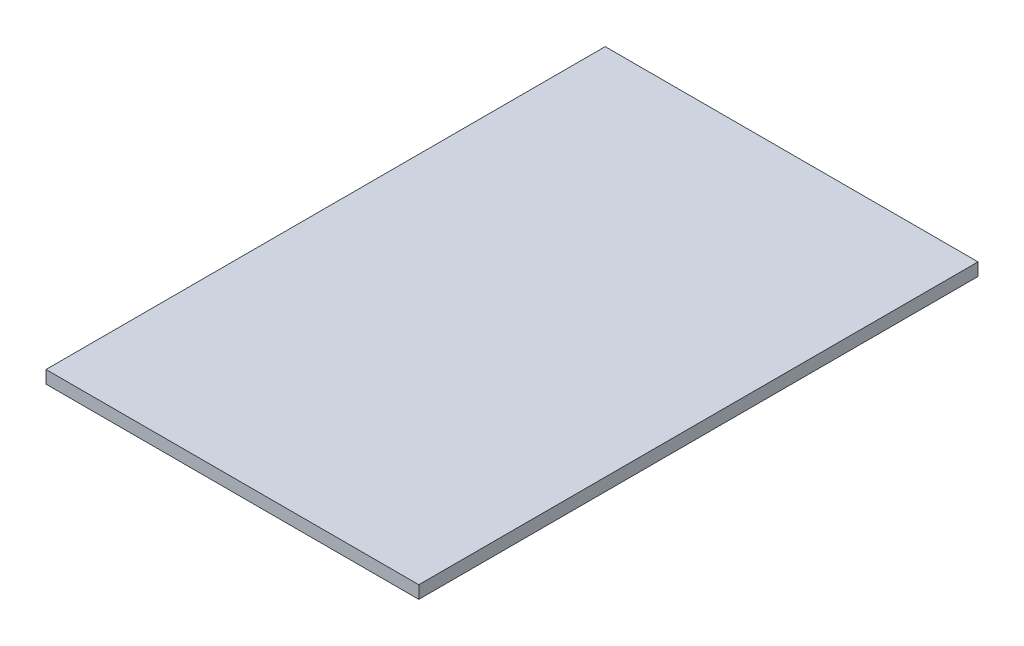
ISO-10303-21;
HEADER;
FILE_DESCRIPTION(('STEP AP214'),'2;1');
FILE_NAME('part.step','',(''),(''),'','','');
FILE_SCHEMA(('AUTOMOTIVE_DESIGN { 1 0 10303 214 1 1 1 1 }'));
ENDSEC;
DATA;
#1=APPLICATION_CONTEXT('core data for automotive mechanical design processes');
#2=APPLICATION_PROTOCOL_DEFINITION('international standard','automotive_design',2000,#1);
#3=PRODUCT_CONTEXT('',#1,'mechanical');
#4=PRODUCT('Part','Part','',(#3));
#5=PRODUCT_RELATED_PRODUCT_CATEGORY('part','',(#4));
#6=PRODUCT_DEFINITION_FORMATION('','',#4);
#7=PRODUCT_DEFINITION_CONTEXT('part definition',#1,'design');
#8=PRODUCT_DEFINITION('design','',#6,#7);
#9=PRODUCT_DEFINITION_SHAPE('','',#8);
#10=(LENGTH_UNIT() NAMED_UNIT(*) SI_UNIT(.MILLI.,.METRE.));
#11=(NAMED_UNIT(*) PLANE_ANGLE_UNIT() SI_UNIT($,.RADIAN.));
#12=(NAMED_UNIT(*) SI_UNIT($,.STERADIAN.) SOLID_ANGLE_UNIT());
#13=UNCERTAINTY_MEASURE_WITH_UNIT(LENGTH_MEASURE(1.E-05),#10,'distance_accuracy_value','');
#14=(GEOMETRIC_REPRESENTATION_CONTEXT(3) GLOBAL_UNCERTAINTY_ASSIGNED_CONTEXT((#13)) GLOBAL_UNIT_ASSIGNED_CONTEXT((#10,
#11,#12)) REPRESENTATION_CONTEXT('',''));
#15=CARTESIAN_POINT('',(0.,0.,0.));
#16=DIRECTION('',(0.,0.,1.));
#17=DIRECTION('',(1.,0.,0.));
#18=AXIS2_PLACEMENT_3D('',#15,#16,#17);
#19=CARTESIAN_POINT('',(-97.5278802689126,19.05,-759.698876734454));
#20=DIRECTION('',(0.,0.,1.));
#21=DIRECTION('',(1.,0.,0.));
#22=AXIS2_PLACEMENT_3D('',#19,#20,#21);
#23=PLANE('',#22);
#24=DIRECTION('',(-1.,0.,0.));
#25=VECTOR('',#24,1.);
#26=CARTESIAN_POINT('',(-97.5278802689126,0.,-759.698876734454));
#27=LINE('',#26,#25);
#28=CARTESIAN_POINT('',(461.272119731088,0.,-759.698876734454));
#29=VERTEX_POINT('',#28);
#30=CARTESIAN_POINT('',(-97.5278802689126,0.,-759.698876734454));
#31=VERTEX_POINT('',#30);
#32=EDGE_CURVE('E96',#29,#31,#27,.T.);
#33=ORIENTED_EDGE('',*,*,#32,.T.);
#34=DIRECTION('',(0.,-1.,0.));
#35=VECTOR('',#34,1.);
#36=CARTESIAN_POINT('',(-97.5278802689126,19.05,-759.698876734454));
#37=LINE('',#36,#35);
#38=CARTESIAN_POINT('',(-97.5278802689126,19.05,-759.698876734454));
#39=VERTEX_POINT('',#38);
#40=EDGE_CURVE('E11',#39,#31,#37,.T.);
#41=ORIENTED_EDGE('',*,*,#40,.F.);
#42=DIRECTION('',(-1.,0.,0.));
#43=VECTOR('',#42,1.);
#44=CARTESIAN_POINT('',(-97.5278802689126,19.05,-759.698876734454));
#45=LINE('',#44,#43);
#46=CARTESIAN_POINT('',(461.272119731088,19.05,-759.698876734454));
#47=VERTEX_POINT('',#46);
#48=EDGE_CURVE('E84',#47,#39,#45,.T.);
#49=ORIENTED_EDGE('',*,*,#48,.F.);
#50=DIRECTION('',(0.,-1.,0.));
#51=VECTOR('',#50,1.);
#52=CARTESIAN_POINT('',(461.272119731088,19.05,-759.698876734454));
#53=LINE('',#52,#51);
#54=EDGE_CURVE('E92',#47,#29,#53,.T.);
#55=ORIENTED_EDGE('',*,*,#54,.T.);
#56=EDGE_LOOP('',(#33,#41,#49,#55));
#57=FACE_BOUND('',#56,.T.);
#58=ADVANCED_FACE('F33',(#57),#23,.F.);
#59=CARTESIAN_POINT('',(-97.5278802689126,19.05,-759.698876734454));
#60=DIRECTION('',(1.,0.,0.));
#61=DIRECTION('',(0.,0.,-1.));
#62=AXIS2_PLACEMENT_3D('',#59,#60,#61);
#63=PLANE('',#62);
#64=DIRECTION('',(0.,0.,1.));
#65=VECTOR('',#64,1.);
#66=CARTESIAN_POINT('',(-97.5278802689126,0.,-759.698876734454));
#67=LINE('',#66,#65);
#68=CARTESIAN_POINT('',(-97.5278802689125,0.,78.5011232655459));
#69=VERTEX_POINT('',#68);
#70=EDGE_CURVE('E88',#31,#69,#67,.T.);
#71=ORIENTED_EDGE('',*,*,#70,.T.);
#72=DIRECTION('',(0.,-1.,0.));
#73=VECTOR('',#72,1.);
#74=CARTESIAN_POINT('',(-97.5278802689125,19.05,78.5011232655459));
#75=LINE('',#74,#73);
#76=CARTESIAN_POINT('',(-97.5278802689125,19.05,78.5011232655459));
#77=VERTEX_POINT('',#76);
#78=EDGE_CURVE('E41',#77,#69,#75,.T.);
#79=ORIENTED_EDGE('',*,*,#78,.F.);
#80=DIRECTION('',(0.,0.,1.));
#81=VECTOR('',#80,1.);
#82=CARTESIAN_POINT('',(-97.5278802689126,19.05,-759.698876734454));
#83=LINE('',#82,#81);
#84=EDGE_CURVE('E79',#39,#77,#83,.T.);
#85=ORIENTED_EDGE('',*,*,#84,.F.);
#86=ORIENTED_EDGE('',*,*,#40,.T.);
#87=EDGE_LOOP('',(#71,#79,#85,#86));
#88=FACE_BOUND('',#87,.T.);
#89=ADVANCED_FACE('F87',(#88),#63,.F.);
#90=CARTESIAN_POINT('',(-97.5278802689125,19.05,78.5011232655459));
#91=DIRECTION('',(0.,0.,-1.));
#92=DIRECTION('',(-1.,0.,0.));
#93=AXIS2_PLACEMENT_3D('',#90,#91,#92);
#94=PLANE('',#93);
#95=DIRECTION('',(1.,0.,0.));
#96=VECTOR('',#95,1.);
#97=CARTESIAN_POINT('',(-97.5278802689125,0.,78.5011232655459));
#98=LINE('',#97,#96);
#99=CARTESIAN_POINT('',(461.272119731087,0.,78.5011232655459));
#100=VERTEX_POINT('',#99);
#101=EDGE_CURVE('E66',#69,#100,#98,.T.);
#102=ORIENTED_EDGE('',*,*,#101,.T.);
#103=DIRECTION('',(0.,-1.,0.));
#104=VECTOR('',#103,1.);
#105=CARTESIAN_POINT('',(461.272119731087,19.05,78.5011232655459));
#106=LINE('',#105,#104);
#107=CARTESIAN_POINT('',(461.272119731087,19.05,78.5011232655459));
#108=VERTEX_POINT('',#107);
#109=EDGE_CURVE('E89',#108,#100,#106,.T.);
#110=ORIENTED_EDGE('',*,*,#109,.F.);
#111=DIRECTION('',(1.,0.,0.));
#112=VECTOR('',#111,1.);
#113=CARTESIAN_POINT('',(-97.5278802689125,19.05,78.5011232655459));
#114=LINE('',#113,#112);
#115=EDGE_CURVE('E82',#77,#108,#114,.T.);
#116=ORIENTED_EDGE('',*,*,#115,.F.);
#117=ORIENTED_EDGE('',*,*,#78,.T.);
#118=EDGE_LOOP('',(#102,#110,#116,#117));
#119=FACE_BOUND('',#118,.T.);
#120=ADVANCED_FACE('F90',(#119),#94,.F.);
#121=CARTESIAN_POINT('',(461.272119731087,19.05,78.5011232655459));
#122=DIRECTION('',(-1.,0.,0.));
#123=DIRECTION('',(0.,0.,1.));
#124=AXIS2_PLACEMENT_3D('',#121,#122,#123);
#125=PLANE('',#124);
#126=DIRECTION('',(0.,0.,-1.));
#127=VECTOR('',#126,1.);
#128=CARTESIAN_POINT('',(461.272119731087,0.,78.5011232655459));
#129=LINE('',#128,#127);
#130=EDGE_CURVE('E72',#100,#29,#129,.T.);
#131=ORIENTED_EDGE('',*,*,#130,.T.);
#132=ORIENTED_EDGE('',*,*,#54,.F.);
#133=DIRECTION('',(0.,0.,-1.));
#134=VECTOR('',#133,1.);
#135=CARTESIAN_POINT('',(461.272119731087,19.05,78.5011232655459));
#136=LINE('',#135,#134);
#137=EDGE_CURVE('E49',#108,#47,#136,.T.);
#138=ORIENTED_EDGE('',*,*,#137,.F.);
#139=ORIENTED_EDGE('',*,*,#109,.T.);
#140=EDGE_LOOP('',(#131,#132,#138,#139));
#141=FACE_BOUND('',#140,.T.);
#142=ADVANCED_FACE('F103',(#141),#125,.F.);
#143=CARTESIAN_POINT('',(0.,19.05,0.));
#144=DIRECTION('',(0.,1.,0.));
#145=DIRECTION('',(0.,0.,1.));
#146=AXIS2_PLACEMENT_3D('',#143,#144,#145);
#147=PLANE('',#146);
#148=ORIENTED_EDGE('',*,*,#48,.T.);
#149=ORIENTED_EDGE('',*,*,#84,.T.);
#150=ORIENTED_EDGE('',*,*,#115,.T.);
#151=ORIENTED_EDGE('',*,*,#137,.T.);
#152=EDGE_LOOP('',(#148,#149,#150,#151));
#153=FACE_BOUND('',#152,.T.);
#154=ADVANCED_FACE('F80',(#153),#147,.T.);
#155=CARTESIAN_POINT('',(0.,0.,0.));
#156=DIRECTION('',(0.,1.,0.));
#157=DIRECTION('',(0.,0.,1.));
#158=AXIS2_PLACEMENT_3D('',#155,#156,#157);
#159=PLANE('',#158);
#160=ORIENTED_EDGE('',*,*,#32,.F.);
#161=ORIENTED_EDGE('',*,*,#130,.F.);
#162=ORIENTED_EDGE('',*,*,#101,.F.);
#163=ORIENTED_EDGE('',*,*,#70,.F.);
#164=EDGE_LOOP('',(#160,#161,#162,#163));
#165=FACE_BOUND('',#164,.T.);
#166=ADVANCED_FACE('F106',(#165),#159,.F.);
#167=CLOSED_SHELL('',(#58,#89,#120,#142,#154,#166));
#168=MANIFOLD_SOLID_BREP('B2',#167);
#169=ADVANCED_BREP_SHAPE_REPRESENTATION('',(#18,#168),#14);
#170=SHAPE_DEFINITION_REPRESENTATION(#9,#169);
ENDSEC;
END-ISO-10303-21;
